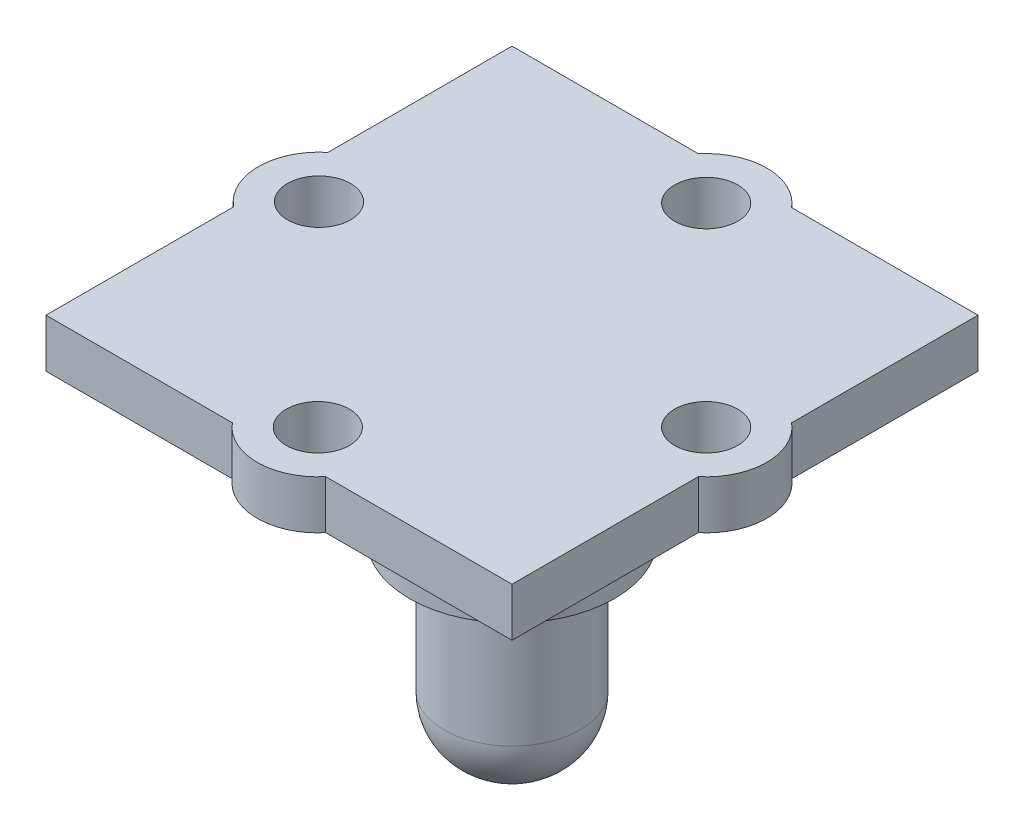
ISO-10303-21;
HEADER;
FILE_DESCRIPTION(('STEP AP214'),'2;1');
FILE_NAME('part.step','',(''),(''),'','','');
FILE_SCHEMA(('AUTOMOTIVE_DESIGN { 1 0 10303 214 1 1 1 1 }'));
ENDSEC;
DATA;
#1=APPLICATION_CONTEXT('core data for automotive mechanical design processes');
#2=APPLICATION_PROTOCOL_DEFINITION('international standard','automotive_design',2000,#1);
#3=PRODUCT_CONTEXT('',#1,'mechanical');
#4=PRODUCT('Part','Part','',(#3));
#5=PRODUCT_RELATED_PRODUCT_CATEGORY('part','',(#4));
#6=PRODUCT_DEFINITION_FORMATION('','',#4);
#7=PRODUCT_DEFINITION_CONTEXT('part definition',#1,'design');
#8=PRODUCT_DEFINITION('design','',#6,#7);
#9=PRODUCT_DEFINITION_SHAPE('','',#8);
#10=(LENGTH_UNIT() NAMED_UNIT(*) SI_UNIT(.MILLI.,.METRE.));
#11=(NAMED_UNIT(*) PLANE_ANGLE_UNIT() SI_UNIT($,.RADIAN.));
#12=(NAMED_UNIT(*) SI_UNIT($,.STERADIAN.) SOLID_ANGLE_UNIT());
#13=UNCERTAINTY_MEASURE_WITH_UNIT(LENGTH_MEASURE(1.E-05),#10,'distance_accuracy_value','');
#14=(GEOMETRIC_REPRESENTATION_CONTEXT(3) GLOBAL_UNCERTAINTY_ASSIGNED_CONTEXT((#13)) GLOBAL_UNIT_ASSIGNED_CONTEXT((#10,
#11,#12)) REPRESENTATION_CONTEXT('',''));
#15=CARTESIAN_POINT('',(0.,0.,0.));
#16=DIRECTION('',(0.,0.,1.));
#17=DIRECTION('',(1.,0.,0.));
#18=AXIS2_PLACEMENT_3D('',#15,#16,#17);
#19=CARTESIAN_POINT('',(20.,5.,0.));
#20=DIRECTION('',(0.,1.,0.));
#21=DIRECTION('',(0.,0.,1.));
#22=AXIS2_PLACEMENT_3D('',#19,#20,#21);
#23=PLANE('',#22);
#24=CARTESIAN_POINT('',(20.,5.,0.));
#25=DIRECTION('',(0.,1.,0.));
#26=DIRECTION('',(0.,0.,1.));
#27=AXIS2_PLACEMENT_3D('',#24,#25,#26);
#28=CIRCLE('',#27,3.25);
#29=CARTESIAN_POINT('',(20.,5.,3.25));
#30=VERTEX_POINT('',#29);
#31=EDGE_CURVE('E465',#30,#30,#28,.T.);
#32=ORIENTED_EDGE('',*,*,#31,.F.);
#33=EDGE_LOOP('',(#32));
#34=FACE_BOUND('',#33,.T.);
#35=CARTESIAN_POINT('',(0.,5.,-20.));
#36=DIRECTION('',(0.,1.,0.));
#37=DIRECTION('',(0.,0.,1.));
#38=AXIS2_PLACEMENT_3D('',#35,#36,#37);
#39=CIRCLE('',#38,3.25);
#40=CARTESIAN_POINT('',(0.,5.,-16.75));
#41=VERTEX_POINT('',#40);
#42=EDGE_CURVE('E396',#41,#41,#39,.T.);
#43=ORIENTED_EDGE('',*,*,#42,.F.);
#44=EDGE_LOOP('',(#43));
#45=FACE_BOUND('',#44,.T.);
#46=DIRECTION('',(1.,0.,0.));
#47=VECTOR('',#46,1.);
#48=CARTESIAN_POINT('',(4.80234317807463,5.,-24.));
#49=LINE('',#48,#47);
#50=CARTESIAN_POINT('',(4.80234317807463,5.,-24.));
#51=VERTEX_POINT('',#50);
#52=CARTESIAN_POINT('',(24.,5.,-24.));
#53=VERTEX_POINT('',#52);
#54=EDGE_CURVE('E421',#51,#53,#49,.T.);
#55=ORIENTED_EDGE('',*,*,#54,.F.);
#56=CARTESIAN_POINT('',(0.,5.,-20.));
#57=DIRECTION('',(0.,1.,0.));
#58=DIRECTION('',(0.,0.,1.));
#59=AXIS2_PLACEMENT_3D('',#56,#57,#58);
#60=CIRCLE('',#59,6.25);
#61=CARTESIAN_POINT('',(-4.80234317807463,5.,-24.));
#62=VERTEX_POINT('',#61);
#63=EDGE_CURVE('E387',#51,#62,#60,.T.);
#64=ORIENTED_EDGE('',*,*,#63,.T.);
#65=DIRECTION('',(1.,0.,0.));
#66=VECTOR('',#65,1.);
#67=CARTESIAN_POINT('',(-24.,5.,-24.));
#68=LINE('',#67,#66);
#69=CARTESIAN_POINT('',(-24.,5.,-24.));
#70=VERTEX_POINT('',#69);
#71=EDGE_CURVE('E370',#70,#62,#68,.T.);
#72=ORIENTED_EDGE('',*,*,#71,.F.);
#73=DIRECTION('',(0.,0.,1.));
#74=VECTOR('',#73,1.);
#75=CARTESIAN_POINT('',(-24.,5.,-24.));
#76=LINE('',#75,#74);
#77=CARTESIAN_POINT('',(-24.,5.,-5.04363246962454));
#78=VERTEX_POINT('',#77);
#79=EDGE_CURVE('E378',#70,#78,#76,.T.);
#80=ORIENTED_EDGE('',*,*,#79,.T.);
#81=CARTESIAN_POINT('',(-20.065667944918,5.,-0.187344660983607));
#82=DIRECTION('',(0.,1.,0.));
#83=DIRECTION('',(0.,0.,1.));
#84=AXIS2_PLACEMENT_3D('',#81,#82,#83);
#85=CIRCLE('',#84,6.25);
#86=CARTESIAN_POINT('',(-24.,5.,4.66894314765733));
#87=VERTEX_POINT('',#86);
#88=EDGE_CURVE('E383',#78,#87,#85,.T.);
#89=ORIENTED_EDGE('',*,*,#88,.T.);
#90=DIRECTION('',(0.,0.,1.));
#91=VECTOR('',#90,1.);
#92=CARTESIAN_POINT('',(-24.,5.,4.66894314765733));
#93=LINE('',#92,#91);
#94=CARTESIAN_POINT('',(-24.,5.,24.));
#95=VERTEX_POINT('',#94);
#96=EDGE_CURVE('E495',#87,#95,#93,.T.);
#97=ORIENTED_EDGE('',*,*,#96,.T.);
#98=DIRECTION('',(1.,0.,0.));
#99=VECTOR('',#98,1.);
#100=CARTESIAN_POINT('',(-24.,5.,24.));
#101=LINE('',#100,#99);
#102=CARTESIAN_POINT('',(-4.80234317807464,5.,24.));
#103=VERTEX_POINT('',#102);
#104=EDGE_CURVE('E493',#95,#103,#101,.T.);
#105=ORIENTED_EDGE('',*,*,#104,.T.);
#106=CARTESIAN_POINT('',(0.,5.,20.));
#107=DIRECTION('',(0.,1.,0.));
#108=DIRECTION('',(0.,0.,1.));
#109=AXIS2_PLACEMENT_3D('',#106,#107,#108);
#110=CIRCLE('',#109,6.25);
#111=CARTESIAN_POINT('',(4.80234317807464,5.,24.));
#112=VERTEX_POINT('',#111);
#113=EDGE_CURVE('E491',#103,#112,#110,.T.);
#114=ORIENTED_EDGE('',*,*,#113,.T.);
#115=DIRECTION('',(1.,0.,0.));
#116=VECTOR('',#115,1.);
#117=CARTESIAN_POINT('',(4.80234317807464,5.,24.));
#118=LINE('',#117,#116);
#119=CARTESIAN_POINT('',(24.,5.,24.));
#120=VERTEX_POINT('',#119);
#121=EDGE_CURVE('E489',#112,#120,#118,.T.);
#122=ORIENTED_EDGE('',*,*,#121,.T.);
#123=DIRECTION('',(0.,0.,1.));
#124=VECTOR('',#123,1.);
#125=CARTESIAN_POINT('',(24.,5.,4.80234317807463));
#126=LINE('',#125,#124);
#127=CARTESIAN_POINT('',(24.,5.,4.80234317807463));
#128=VERTEX_POINT('',#127);
#129=EDGE_CURVE('E486',#128,#120,#126,.T.);
#130=ORIENTED_EDGE('',*,*,#129,.F.);
#131=CARTESIAN_POINT('',(20.,5.,0.));
#132=DIRECTION('',(0.,1.,0.));
#133=DIRECTION('',(0.,0.,1.));
#134=AXIS2_PLACEMENT_3D('',#131,#132,#133);
#135=CIRCLE('',#134,6.25);
#136=CARTESIAN_POINT('',(24.,5.,-4.80234317807464));
#137=VERTEX_POINT('',#136);
#138=EDGE_CURVE('E484',#128,#137,#135,.T.);
#139=ORIENTED_EDGE('',*,*,#138,.T.);
#140=DIRECTION('',(0.,0.,1.));
#141=VECTOR('',#140,1.);
#142=CARTESIAN_POINT('',(24.,5.,-24.));
#143=LINE('',#142,#141);
#144=EDGE_CURVE('E482',#53,#137,#143,.T.);
#145=ORIENTED_EDGE('',*,*,#144,.F.);
#146=EDGE_LOOP('',(#55,#64,#72,#80,#89,#97,#105,#114,#122,#130,#139,#145));
#147=FACE_BOUND('',#146,.T.);
#148=CARTESIAN_POINT('',(0.,5.,20.));
#149=DIRECTION('',(0.,1.,0.));
#150=DIRECTION('',(0.,0.,1.));
#151=AXIS2_PLACEMENT_3D('',#148,#149,#150);
#152=CIRCLE('',#151,3.25);
#153=CARTESIAN_POINT('',(0.,5.,23.25));
#154=VERTEX_POINT('',#153);
#155=EDGE_CURVE('E471',#154,#154,#152,.T.);
#156=ORIENTED_EDGE('',*,*,#155,.F.);
#157=EDGE_LOOP('',(#156));
#158=FACE_BOUND('',#157,.T.);
#159=CARTESIAN_POINT('',(-20.065667944918,5.,-0.187344660983607));
#160=DIRECTION('',(0.,1.,0.));
#161=DIRECTION('',(0.,0.,1.));
#162=AXIS2_PLACEMENT_3D('',#159,#160,#161);
#163=CIRCLE('',#162,3.25);
#164=CARTESIAN_POINT('',(-20.065667944918,5.,3.06265533901639));
#165=VERTEX_POINT('',#164);
#166=EDGE_CURVE('E459',#165,#165,#163,.T.);
#167=ORIENTED_EDGE('',*,*,#166,.F.);
#168=EDGE_LOOP('',(#167));
#169=FACE_BOUND('',#168,.T.);
#170=ADVANCED_FACE('F269',(#34,#45,#147,#158,#169),#23,.T.);
#171=CARTESIAN_POINT('',(20.,0.,0.));
#172=DIRECTION('',(0.,1.,0.));
#173=DIRECTION('',(0.,0.,1.));
#174=AXIS2_PLACEMENT_3D('',#171,#172,#173);
#175=PLANE('',#174);
#176=CARTESIAN_POINT('',(0.,0.,0.));
#177=DIRECTION('',(0.,1.,0.));
#178=DIRECTION('',(0.,0.,1.));
#179=AXIS2_PLACEMENT_3D('',#176,#177,#178);
#180=CIRCLE('',#179,10.5671935359598);
#181=CARTESIAN_POINT('',(0.,0.,10.5671935359598));
#182=VERTEX_POINT('',#181);
#183=EDGE_CURVE('E423',#182,#182,#180,.F.);
#184=ORIENTED_EDGE('',*,*,#183,.F.);
#185=EDGE_LOOP('',(#184));
#186=FACE_BOUND('',#185,.T.);
#187=DIRECTION('',(1.,0.,0.));
#188=VECTOR('',#187,1.);
#189=CARTESIAN_POINT('',(4.80234317807463,0.,-24.));
#190=LINE('',#189,#188);
#191=CARTESIAN_POINT('',(4.80234317807463,0.,-24.));
#192=VERTEX_POINT('',#191);
#193=CARTESIAN_POINT('',(24.,0.,-24.));
#194=VERTEX_POINT('',#193);
#195=EDGE_CURVE('E392',#192,#194,#190,.T.);
#196=ORIENTED_EDGE('',*,*,#195,.T.);
#197=DIRECTION('',(0.,0.,1.));
#198=VECTOR('',#197,1.);
#199=CARTESIAN_POINT('',(24.,0.,-24.));
#200=LINE('',#199,#198);
#201=CARTESIAN_POINT('',(24.,0.,-4.80234317807464));
#202=VERTEX_POINT('',#201);
#203=EDGE_CURVE('E395',#194,#202,#200,.T.);
#204=ORIENTED_EDGE('',*,*,#203,.T.);
#205=CARTESIAN_POINT('',(20.,0.,0.));
#206=DIRECTION('',(0.,1.,0.));
#207=DIRECTION('',(0.,0.,1.));
#208=AXIS2_PLACEMENT_3D('',#205,#206,#207);
#209=CIRCLE('',#208,6.25);
#210=CARTESIAN_POINT('',(24.,0.,4.80234317807463));
#211=VERTEX_POINT('',#210);
#212=EDGE_CURVE('E399',#211,#202,#209,.T.);
#213=ORIENTED_EDGE('',*,*,#212,.F.);
#214=DIRECTION('',(0.,0.,1.));
#215=VECTOR('',#214,1.);
#216=CARTESIAN_POINT('',(24.,0.,4.80234317807463));
#217=LINE('',#216,#215);
#218=CARTESIAN_POINT('',(24.,0.,24.));
#219=VERTEX_POINT('',#218);
#220=EDGE_CURVE('E402',#211,#219,#217,.T.);
#221=ORIENTED_EDGE('',*,*,#220,.T.);
#222=DIRECTION('',(1.,0.,0.));
#223=VECTOR('',#222,1.);
#224=CARTESIAN_POINT('',(4.80234317807464,0.,24.));
#225=LINE('',#224,#223);
#226=CARTESIAN_POINT('',(4.80234317807464,0.,24.));
#227=VERTEX_POINT('',#226);
#228=EDGE_CURVE('E405',#227,#219,#225,.T.);
#229=ORIENTED_EDGE('',*,*,#228,.F.);
#230=CARTESIAN_POINT('',(0.,0.,20.));
#231=DIRECTION('',(0.,1.,0.));
#232=DIRECTION('',(0.,0.,1.));
#233=AXIS2_PLACEMENT_3D('',#230,#231,#232);
#234=CIRCLE('',#233,6.25);
#235=CARTESIAN_POINT('',(-4.80234317807464,0.,24.));
#236=VERTEX_POINT('',#235);
#237=EDGE_CURVE('E408',#236,#227,#234,.T.);
#238=ORIENTED_EDGE('',*,*,#237,.F.);
#239=DIRECTION('',(1.,0.,0.));
#240=VECTOR('',#239,1.);
#241=CARTESIAN_POINT('',(-24.,0.,24.));
#242=LINE('',#241,#240);
#243=CARTESIAN_POINT('',(-24.,0.,24.));
#244=VERTEX_POINT('',#243);
#245=EDGE_CURVE('E410',#244,#236,#242,.T.);
#246=ORIENTED_EDGE('',*,*,#245,.F.);
#247=DIRECTION('',(0.,0.,1.));
#248=VECTOR('',#247,1.);
#249=CARTESIAN_POINT('',(-24.,0.,4.66894314765733));
#250=LINE('',#249,#248);
#251=CARTESIAN_POINT('',(-24.,0.,4.66894314765733));
#252=VERTEX_POINT('',#251);
#253=EDGE_CURVE('E412',#252,#244,#250,.T.);
#254=ORIENTED_EDGE('',*,*,#253,.F.);
#255=CARTESIAN_POINT('',(-20.065667944918,0.,-0.187344660983607));
#256=DIRECTION('',(0.,1.,0.));
#257=DIRECTION('',(0.,0.,1.));
#258=AXIS2_PLACEMENT_3D('',#255,#256,#257);
#259=CIRCLE('',#258,6.25);
#260=CARTESIAN_POINT('',(-24.,0.,-5.04363246962454));
#261=VERTEX_POINT('',#260);
#262=EDGE_CURVE('E414',#261,#252,#259,.T.);
#263=ORIENTED_EDGE('',*,*,#262,.F.);
#264=DIRECTION('',(0.,0.,1.));
#265=VECTOR('',#264,1.);
#266=CARTESIAN_POINT('',(-24.,0.,-24.));
#267=LINE('',#266,#265);
#268=CARTESIAN_POINT('',(-24.,0.,-24.));
#269=VERTEX_POINT('',#268);
#270=EDGE_CURVE('E416',#269,#261,#267,.T.);
#271=ORIENTED_EDGE('',*,*,#270,.F.);
#272=DIRECTION('',(1.,0.,0.));
#273=VECTOR('',#272,1.);
#274=CARTESIAN_POINT('',(-24.,0.,-24.));
#275=LINE('',#274,#273);
#276=CARTESIAN_POINT('',(-4.80234317807463,0.,-24.));
#277=VERTEX_POINT('',#276);
#278=EDGE_CURVE('E372',#269,#277,#275,.T.);
#279=ORIENTED_EDGE('',*,*,#278,.T.);
#280=CARTESIAN_POINT('',(0.,0.,-20.));
#281=DIRECTION('',(0.,1.,0.));
#282=DIRECTION('',(0.,0.,1.));
#283=AXIS2_PLACEMENT_3D('',#280,#281,#282);
#284=CIRCLE('',#283,6.25);
#285=EDGE_CURVE('E419',#192,#277,#284,.T.);
#286=ORIENTED_EDGE('',*,*,#285,.F.);
#287=EDGE_LOOP('',(#196,#204,#213,#221,#229,#238,#246,#254,#263,#271,#279,#286));
#288=FACE_BOUND('',#287,.T.);
#289=CARTESIAN_POINT('',(0.,0.,-20.));
#290=DIRECTION('',(0.,1.,0.));
#291=DIRECTION('',(0.,0.,1.));
#292=AXIS2_PLACEMENT_3D('',#289,#290,#291);
#293=CIRCLE('',#292,3.25);
#294=CARTESIAN_POINT('',(0.,0.,-16.75));
#295=VERTEX_POINT('',#294);
#296=EDGE_CURVE('E474',#295,#295,#293,.T.);
#297=ORIENTED_EDGE('',*,*,#296,.T.);
#298=EDGE_LOOP('',(#297));
#299=FACE_BOUND('',#298,.T.);
#300=CARTESIAN_POINT('',(0.,0.,20.));
#301=DIRECTION('',(0.,1.,0.));
#302=DIRECTION('',(0.,0.,1.));
#303=AXIS2_PLACEMENT_3D('',#300,#301,#302);
#304=CIRCLE('',#303,3.25);
#305=CARTESIAN_POINT('',(0.,0.,23.25));
#306=VERTEX_POINT('',#305);
#307=EDGE_CURVE('E468',#306,#306,#304,.T.);
#308=ORIENTED_EDGE('',*,*,#307,.T.);
#309=EDGE_LOOP('',(#308));
#310=FACE_BOUND('',#309,.T.);
#311=CARTESIAN_POINT('',(20.,0.,0.));
#312=DIRECTION('',(0.,1.,0.));
#313=DIRECTION('',(0.,0.,1.));
#314=AXIS2_PLACEMENT_3D('',#311,#312,#313);
#315=CIRCLE('',#314,3.25);
#316=CARTESIAN_POINT('',(20.,0.,3.25));
#317=VERTEX_POINT('',#316);
#318=EDGE_CURVE('E462',#317,#317,#315,.T.);
#319=ORIENTED_EDGE('',*,*,#318,.T.);
#320=EDGE_LOOP('',(#319));
#321=FACE_BOUND('',#320,.T.);
#322=CARTESIAN_POINT('',(-20.065667944918,0.,-0.187344660983607));
#323=DIRECTION('',(0.,1.,0.));
#324=DIRECTION('',(0.,0.,1.));
#325=AXIS2_PLACEMENT_3D('',#322,#323,#324);
#326=CIRCLE('',#325,3.25);
#327=CARTESIAN_POINT('',(-20.065667944918,0.,3.06265533901639));
#328=VERTEX_POINT('',#327);
#329=EDGE_CURVE('E458',#328,#328,#326,.T.);
#330=ORIENTED_EDGE('',*,*,#329,.T.);
#331=EDGE_LOOP('',(#330));
#332=FACE_BOUND('',#331,.T.);
#333=ADVANCED_FACE('F542',(#186,#288,#299,#310,#321,#332),#175,.F.);
#334=CARTESIAN_POINT('',(4.80234317807463,5.,-24.));
#335=DIRECTION('',(0.,0.,-1.));
#336=DIRECTION('',(-1.,0.,0.));
#337=AXIS2_PLACEMENT_3D('',#334,#335,#336);
#338=PLANE('',#337);
#339=ORIENTED_EDGE('',*,*,#195,.F.);
#340=DIRECTION('',(0.,-1.,0.));
#341=VECTOR('',#340,1.);
#342=CARTESIAN_POINT('',(4.80234317807463,5.,-24.));
#343=LINE('',#342,#341);
#344=EDGE_CURVE('E287',#51,#192,#343,.T.);
#345=ORIENTED_EDGE('',*,*,#344,.F.);
#346=ORIENTED_EDGE('',*,*,#54,.T.);
#347=DIRECTION('',(0.,-1.,0.));
#348=VECTOR('',#347,1.);
#349=CARTESIAN_POINT('',(24.,5.,-24.));
#350=LINE('',#349,#348);
#351=EDGE_CURVE('E340',#53,#194,#350,.T.);
#352=ORIENTED_EDGE('',*,*,#351,.T.);
#353=EDGE_LOOP('',(#339,#345,#346,#352));
#354=FACE_BOUND('',#353,.T.);
#355=ADVANCED_FACE('F548',(#354),#338,.T.);
#356=CARTESIAN_POINT('',(0.,5.,-20.));
#357=DIRECTION('',(0.,-1.,0.));
#358=DIRECTION('',(0.,0.,-1.));
#359=AXIS2_PLACEMENT_3D('',#356,#357,#358);
#360=CYLINDRICAL_SURFACE('',#359,6.25);
#361=ORIENTED_EDGE('',*,*,#285,.T.);
#362=DIRECTION('',(0.,-1.,0.));
#363=VECTOR('',#362,1.);
#364=CARTESIAN_POINT('',(-4.80234317807463,5.,-24.));
#365=LINE('',#364,#363);
#366=EDGE_CURVE('E329',#62,#277,#365,.T.);
#367=ORIENTED_EDGE('',*,*,#366,.F.);
#368=ORIENTED_EDGE('',*,*,#63,.F.);
#369=ORIENTED_EDGE('',*,*,#344,.T.);
#370=EDGE_LOOP('',(#361,#367,#368,#369));
#371=FACE_BOUND('',#370,.T.);
#372=ADVANCED_FACE('F555',(#371),#360,.T.);
#373=CARTESIAN_POINT('',(-24.,5.,-24.));
#374=DIRECTION('',(0.,0.,-1.));
#375=DIRECTION('',(-1.,0.,0.));
#376=AXIS2_PLACEMENT_3D('',#373,#374,#375);
#377=PLANE('',#376);
#378=ORIENTED_EDGE('',*,*,#278,.F.);
#379=DIRECTION('',(0.,-1.,0.));
#380=VECTOR('',#379,1.);
#381=CARTESIAN_POINT('',(-24.,5.,-24.));
#382=LINE('',#381,#380);
#383=EDGE_CURVE('E366',#70,#269,#382,.T.);
#384=ORIENTED_EDGE('',*,*,#383,.F.);
#385=ORIENTED_EDGE('',*,*,#71,.T.);
#386=ORIENTED_EDGE('',*,*,#366,.T.);
#387=EDGE_LOOP('',(#378,#384,#385,#386));
#388=FACE_BOUND('',#387,.T.);
#389=ADVANCED_FACE('F368',(#388),#377,.T.);
#390=CARTESIAN_POINT('',(-24.,5.,-24.));
#391=DIRECTION('',(1.,0.,0.));
#392=DIRECTION('',(0.,0.,-1.));
#393=AXIS2_PLACEMENT_3D('',#390,#391,#392);
#394=PLANE('',#393);
#395=ORIENTED_EDGE('',*,*,#270,.T.);
#396=DIRECTION('',(0.,-1.,0.));
#397=VECTOR('',#396,1.);
#398=CARTESIAN_POINT('',(-24.,5.,-5.04363246962454));
#399=LINE('',#398,#397);
#400=EDGE_CURVE('E375',#78,#261,#399,.T.);
#401=ORIENTED_EDGE('',*,*,#400,.F.);
#402=ORIENTED_EDGE('',*,*,#79,.F.);
#403=ORIENTED_EDGE('',*,*,#383,.T.);
#404=EDGE_LOOP('',(#395,#401,#402,#403));
#405=FACE_BOUND('',#404,.T.);
#406=ADVANCED_FACE('F379',(#405),#394,.F.);
#407=CARTESIAN_POINT('',(-20.065667944918,5.,-0.187344660983607));
#408=DIRECTION('',(0.,-1.,0.));
#409=DIRECTION('',(0.,0.,-1.));
#410=AXIS2_PLACEMENT_3D('',#407,#408,#409);
#411=CYLINDRICAL_SURFACE('',#410,6.25);
#412=ORIENTED_EDGE('',*,*,#262,.T.);
#413=DIRECTION('',(0.,-1.,0.));
#414=VECTOR('',#413,1.);
#415=CARTESIAN_POINT('',(-24.,5.,4.66894314765733));
#416=LINE('',#415,#414);
#417=EDGE_CURVE('E426',#87,#252,#416,.T.);
#418=ORIENTED_EDGE('',*,*,#417,.F.);
#419=ORIENTED_EDGE('',*,*,#88,.F.);
#420=ORIENTED_EDGE('',*,*,#400,.T.);
#421=EDGE_LOOP('',(#412,#418,#419,#420));
#422=FACE_BOUND('',#421,.T.);
#423=ADVANCED_FACE('F500',(#422),#411,.T.);
#424=CARTESIAN_POINT('',(-24.,5.,4.66894314765733));
#425=DIRECTION('',(1.,0.,0.));
#426=DIRECTION('',(0.,0.,-1.));
#427=AXIS2_PLACEMENT_3D('',#424,#425,#426);
#428=PLANE('',#427);
#429=ORIENTED_EDGE('',*,*,#253,.T.);
#430=DIRECTION('',(0.,-1.,0.));
#431=VECTOR('',#430,1.);
#432=CARTESIAN_POINT('',(-24.,5.,24.));
#433=LINE('',#432,#431);
#434=EDGE_CURVE('E429',#95,#244,#433,.T.);
#435=ORIENTED_EDGE('',*,*,#434,.F.);
#436=ORIENTED_EDGE('',*,*,#96,.F.);
#437=ORIENTED_EDGE('',*,*,#417,.T.);
#438=EDGE_LOOP('',(#429,#435,#436,#437));
#439=FACE_BOUND('',#438,.T.);
#440=ADVANCED_FACE('F504',(#439),#428,.F.);
#441=CARTESIAN_POINT('',(-24.,5.,24.));
#442=DIRECTION('',(0.,0.,-1.));
#443=DIRECTION('',(-1.,0.,0.));
#444=AXIS2_PLACEMENT_3D('',#441,#442,#443);
#445=PLANE('',#444);
#446=ORIENTED_EDGE('',*,*,#245,.T.);
#447=DIRECTION('',(0.,-1.,0.));
#448=VECTOR('',#447,1.);
#449=CARTESIAN_POINT('',(-4.80234317807464,5.,24.));
#450=LINE('',#449,#448);
#451=EDGE_CURVE('E432',#103,#236,#450,.T.);
#452=ORIENTED_EDGE('',*,*,#451,.F.);
#453=ORIENTED_EDGE('',*,*,#104,.F.);
#454=ORIENTED_EDGE('',*,*,#434,.T.);
#455=EDGE_LOOP('',(#446,#452,#453,#454));
#456=FACE_BOUND('',#455,.T.);
#457=ADVANCED_FACE('F509',(#456),#445,.F.);
#458=CARTESIAN_POINT('',(0.,5.,20.));
#459=DIRECTION('',(0.,-1.,0.));
#460=DIRECTION('',(0.,0.,-1.));
#461=AXIS2_PLACEMENT_3D('',#458,#459,#460);
#462=CYLINDRICAL_SURFACE('',#461,6.25);
#463=ORIENTED_EDGE('',*,*,#237,.T.);
#464=DIRECTION('',(0.,-1.,0.));
#465=VECTOR('',#464,1.);
#466=CARTESIAN_POINT('',(4.80234317807464,5.,24.));
#467=LINE('',#466,#465);
#468=EDGE_CURVE('E435',#112,#227,#467,.T.);
#469=ORIENTED_EDGE('',*,*,#468,.F.);
#470=ORIENTED_EDGE('',*,*,#113,.F.);
#471=ORIENTED_EDGE('',*,*,#451,.T.);
#472=EDGE_LOOP('',(#463,#469,#470,#471));
#473=FACE_BOUND('',#472,.T.);
#474=ADVANCED_FACE('F516',(#473),#462,.T.);
#475=CARTESIAN_POINT('',(4.80234317807464,5.,24.));
#476=DIRECTION('',(0.,0.,-1.));
#477=DIRECTION('',(-1.,0.,0.));
#478=AXIS2_PLACEMENT_3D('',#475,#476,#477);
#479=PLANE('',#478);
#480=ORIENTED_EDGE('',*,*,#228,.T.);
#481=DIRECTION('',(0.,-1.,0.));
#482=VECTOR('',#481,1.);
#483=CARTESIAN_POINT('',(24.,5.,24.));
#484=LINE('',#483,#482);
#485=EDGE_CURVE('E438',#120,#219,#484,.T.);
#486=ORIENTED_EDGE('',*,*,#485,.F.);
#487=ORIENTED_EDGE('',*,*,#121,.F.);
#488=ORIENTED_EDGE('',*,*,#468,.T.);
#489=EDGE_LOOP('',(#480,#486,#487,#488));
#490=FACE_BOUND('',#489,.T.);
#491=ADVANCED_FACE('F520',(#490),#479,.F.);
#492=CARTESIAN_POINT('',(24.,5.,4.80234317807463));
#493=DIRECTION('',(1.,0.,0.));
#494=DIRECTION('',(0.,0.,-1.));
#495=AXIS2_PLACEMENT_3D('',#492,#493,#494);
#496=PLANE('',#495);
#497=ORIENTED_EDGE('',*,*,#220,.F.);
#498=DIRECTION('',(0.,-1.,0.));
#499=VECTOR('',#498,1.);
#500=CARTESIAN_POINT('',(24.,5.,4.80234317807463));
#501=LINE('',#500,#499);
#502=EDGE_CURVE('E440',#128,#211,#501,.T.);
#503=ORIENTED_EDGE('',*,*,#502,.F.);
#504=ORIENTED_EDGE('',*,*,#129,.T.);
#505=ORIENTED_EDGE('',*,*,#485,.T.);
#506=EDGE_LOOP('',(#497,#503,#504,#505));
#507=FACE_BOUND('',#506,.T.);
#508=ADVANCED_FACE('F523',(#507),#496,.T.);
#509=CARTESIAN_POINT('',(20.,5.,0.));
#510=DIRECTION('',(0.,-1.,0.));
#511=DIRECTION('',(0.,0.,-1.));
#512=AXIS2_PLACEMENT_3D('',#509,#510,#511);
#513=CYLINDRICAL_SURFACE('',#512,6.25);
#514=ORIENTED_EDGE('',*,*,#212,.T.);
#515=DIRECTION('',(0.,-1.,0.));
#516=VECTOR('',#515,1.);
#517=CARTESIAN_POINT('',(24.,5.,-4.80234317807464));
#518=LINE('',#517,#516);
#519=EDGE_CURVE('E442',#137,#202,#518,.T.);
#520=ORIENTED_EDGE('',*,*,#519,.F.);
#521=ORIENTED_EDGE('',*,*,#138,.F.);
#522=ORIENTED_EDGE('',*,*,#502,.T.);
#523=EDGE_LOOP('',(#514,#520,#521,#522));
#524=FACE_BOUND('',#523,.T.);
#525=ADVANCED_FACE('F527',(#524),#513,.T.);
#526=CARTESIAN_POINT('',(24.,5.,-24.));
#527=DIRECTION('',(1.,0.,0.));
#528=DIRECTION('',(0.,0.,-1.));
#529=AXIS2_PLACEMENT_3D('',#526,#527,#528);
#530=PLANE('',#529);
#531=ORIENTED_EDGE('',*,*,#203,.F.);
#532=ORIENTED_EDGE('',*,*,#351,.F.);
#533=ORIENTED_EDGE('',*,*,#144,.T.);
#534=ORIENTED_EDGE('',*,*,#519,.T.);
#535=EDGE_LOOP('',(#531,#532,#533,#534));
#536=FACE_BOUND('',#535,.T.);
#537=ADVANCED_FACE('F529',(#536),#530,.T.);
#538=CARTESIAN_POINT('',(0.,5.,-20.));
#539=DIRECTION('',(0.,-1.,0.));
#540=DIRECTION('',(0.,0.,-1.));
#541=AXIS2_PLACEMENT_3D('',#538,#539,#540);
#542=CYLINDRICAL_SURFACE('',#541,3.25);
#543=ORIENTED_EDGE('',*,*,#42,.T.);
#544=EDGE_LOOP('',(#543));
#545=FACE_BOUND('',#544,.T.);
#546=ORIENTED_EDGE('',*,*,#296,.F.);
#547=EDGE_LOOP('',(#546));
#548=FACE_BOUND('',#547,.T.);
#549=ADVANCED_FACE('F531',(#545,#548),#542,.F.);
#550=CARTESIAN_POINT('',(0.,5.,20.));
#551=DIRECTION('',(0.,-1.,0.));
#552=DIRECTION('',(0.,0.,-1.));
#553=AXIS2_PLACEMENT_3D('',#550,#551,#552);
#554=CYLINDRICAL_SURFACE('',#553,3.25);
#555=ORIENTED_EDGE('',*,*,#155,.T.);
#556=EDGE_LOOP('',(#555));
#557=FACE_BOUND('',#556,.T.);
#558=ORIENTED_EDGE('',*,*,#307,.F.);
#559=EDGE_LOOP('',(#558));
#560=FACE_BOUND('',#559,.T.);
#561=ADVANCED_FACE('F537',(#557,#560),#554,.F.);
#562=CARTESIAN_POINT('',(20.,5.,0.));
#563=DIRECTION('',(0.,-1.,0.));
#564=DIRECTION('',(0.,0.,-1.));
#565=AXIS2_PLACEMENT_3D('',#562,#563,#564);
#566=CYLINDRICAL_SURFACE('',#565,3.25);
#567=ORIENTED_EDGE('',*,*,#31,.T.);
#568=EDGE_LOOP('',(#567));
#569=FACE_BOUND('',#568,.T.);
#570=ORIENTED_EDGE('',*,*,#318,.F.);
#571=EDGE_LOOP('',(#570));
#572=FACE_BOUND('',#571,.T.);
#573=ADVANCED_FACE('F600',(#569,#572),#566,.F.);
#574=CARTESIAN_POINT('',(-20.065667944918,5.,-0.187344660983607));
#575=DIRECTION('',(0.,-1.,0.));
#576=DIRECTION('',(0.,0.,-1.));
#577=AXIS2_PLACEMENT_3D('',#574,#575,#576);
#578=CYLINDRICAL_SURFACE('',#577,3.25);
#579=ORIENTED_EDGE('',*,*,#166,.T.);
#580=EDGE_LOOP('',(#579));
#581=FACE_BOUND('',#580,.T.);
#582=ORIENTED_EDGE('',*,*,#329,.F.);
#583=EDGE_LOOP('',(#582));
#584=FACE_BOUND('',#583,.T.);
#585=ADVANCED_FACE('F609',(#581,#584),#578,.F.);
#586=CARTESIAN_POINT('',(0.,-15.,0.));
#587=DIRECTION('',(0.,1.,0.));
#588=DIRECTION('',(0.,0.,1.));
#589=AXIS2_PLACEMENT_3D('',#586,#587,#588);
#590=CYLINDRICAL_SURFACE('',#589,10.5671935359598);
#591=CARTESIAN_POINT('',(0.,-15.,0.));
#592=DIRECTION('',(0.,-1.,0.));
#593=DIRECTION('',(0.,0.,-1.));
#594=AXIS2_PLACEMENT_3D('',#591,#592,#593);
#595=CIRCLE('',#594,10.5671935359598);
#596=CARTESIAN_POINT('',(0.,-15.,-10.5671935359598));
#597=VERTEX_POINT('',#596);
#598=EDGE_CURVE('E455',#597,#597,#595,.T.);
#599=ORIENTED_EDGE('',*,*,#598,.F.);
#600=EDGE_LOOP('',(#599));
#601=FACE_BOUND('',#600,.T.);
#602=ORIENTED_EDGE('',*,*,#183,.T.);
#603=EDGE_LOOP('',(#602));
#604=FACE_BOUND('',#603,.T.);
#605=ADVANCED_FACE('F618',(#601,#604),#590,.T.);
#606=CARTESIAN_POINT('',(0.,-15.,0.));
#607=DIRECTION('',(0.,-1.,0.));
#608=DIRECTION('',(0.,0.,-1.));
#609=AXIS2_PLACEMENT_3D('',#606,#607,#608);
#610=PLANE('',#609);
#611=CARTESIAN_POINT('',(0.,-15.,0.));
#612=DIRECTION('',(0.,-1.,0.));
#613=DIRECTION('',(0.,0.,-1.));
#614=AXIS2_PLACEMENT_3D('',#611,#612,#613);
#615=CIRCLE('',#614,7.);
#616=CARTESIAN_POINT('',(0.,-15.,-7.));
#617=VERTEX_POINT('',#616);
#618=EDGE_CURVE('E446',#617,#617,#615,.T.);
#619=ORIENTED_EDGE('',*,*,#618,.F.);
#620=EDGE_LOOP('',(#619));
#621=FACE_BOUND('',#620,.T.);
#622=ORIENTED_EDGE('',*,*,#598,.T.);
#623=EDGE_LOOP('',(#622));
#624=FACE_BOUND('',#623,.T.);
#625=ADVANCED_FACE('F642',(#621,#624),#610,.T.);
#626=CARTESIAN_POINT('',(0.,-35.,0.));
#627=DIRECTION('',(0.,1.,0.));
#628=DIRECTION('',(0.,0.,1.));
#629=AXIS2_PLACEMENT_3D('',#626,#627,#628);
#630=CYLINDRICAL_SURFACE('',#629,7.);
#631=CARTESIAN_POINT('',(0.,-28.5,0.));
#632=DIRECTION('',(0.,-1.,0.));
#633=DIRECTION('',(0.,0.,-1.));
#634=AXIS2_PLACEMENT_3D('',#631,#632,#633);
#635=CIRCLE('',#634,7.);
#636=CARTESIAN_POINT('',(0.,-28.5,-7.));
#637=VERTEX_POINT('',#636);
#638=EDGE_CURVE('E12',#637,#637,#635,.F.);
#639=ORIENTED_EDGE('',*,*,#638,.T.);
#640=EDGE_LOOP('',(#639));
#641=FACE_BOUND('',#640,.T.);
#642=ORIENTED_EDGE('',*,*,#618,.T.);
#643=EDGE_LOOP('',(#642));
#644=FACE_BOUND('',#643,.T.);
#645=ADVANCED_FACE('F652',(#641,#644),#630,.T.);
#646=CARTESIAN_POINT('',(0.,-35.,0.));
#647=DIRECTION('',(0.,-1.,0.));
#648=DIRECTION('',(0.,0.,-1.));
#649=AXIS2_PLACEMENT_3D('',#646,#647,#648);
#650=PLANE('',#649);
#651=CARTESIAN_POINT('',(0.,-35.,0.));
#652=DIRECTION('',(0.,-1.,0.));
#653=DIRECTION('',(0.,0.,-1.));
#654=AXIS2_PLACEMENT_3D('',#651,#652,#653);
#655=CIRCLE('',#654,0.5);
#656=CARTESIAN_POINT('',(0.,-35.,-0.5));
#657=VERTEX_POINT('',#656);
#658=EDGE_CURVE('E279',#657,#657,#655,.T.);
#659=ORIENTED_EDGE('',*,*,#658,.T.);
#660=EDGE_LOOP('',(#659));
#661=FACE_BOUND('',#660,.T.);
#662=ADVANCED_FACE('F663',(#661),#650,.T.);
#663=CARTESIAN_POINT('',(0.,-28.5,0.));
#664=DIRECTION('',(0.,-1.,0.));
#665=DIRECTION('',(0.,0.,-1.));
#666=AXIS2_PLACEMENT_3D('',#663,#664,#665);
#667=DEGENERATE_TOROIDAL_SURFACE('',#666,0.5,6.5,.T.);
#668=ORIENTED_EDGE('',*,*,#638,.F.);
#669=EDGE_LOOP('',(#668));
#670=FACE_BOUND('',#669,.T.);
#671=ORIENTED_EDGE('',*,*,#658,.F.);
#672=EDGE_LOOP('',(#671));
#673=FACE_BOUND('',#672,.T.);
#674=ADVANCED_FACE('F271',(#670,#673),#667,.T.);
#675=CLOSED_SHELL('',(#170,#333,#355,#372,#389,#406,#423,#440,#457,#474,#491,#508,#525,#537,
#549,#561,#573,#585,#605,#625,#645,#662,#674));
#676=MANIFOLD_SOLID_BREP('B2',#675);
#677=ADVANCED_BREP_SHAPE_REPRESENTATION('',(#18,#676),#14);
#678=SHAPE_DEFINITION_REPRESENTATION(#9,#677);
ENDSEC;
END-ISO-10303-21;
